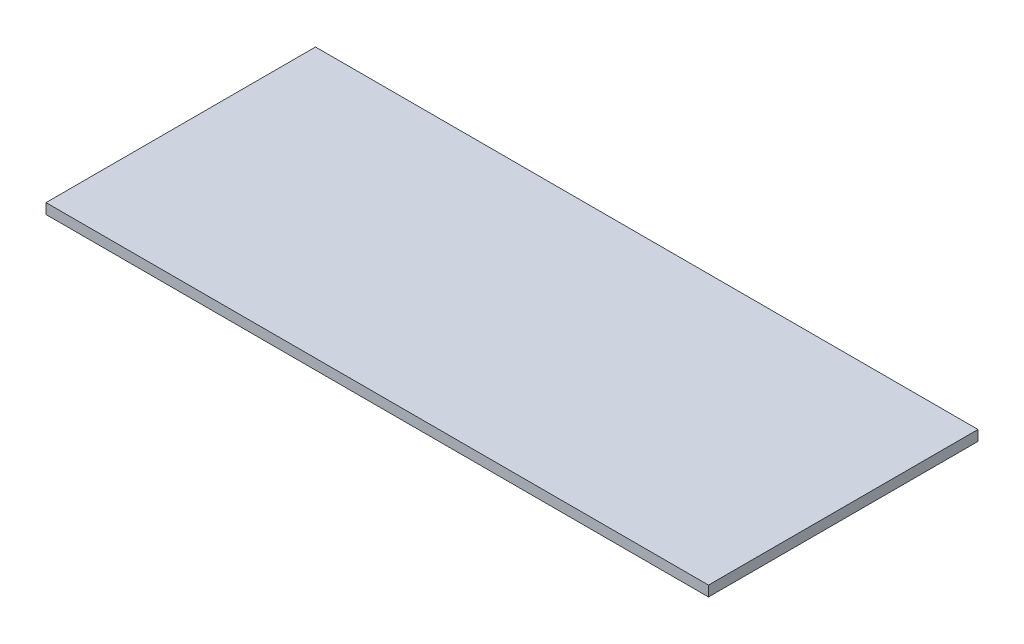
ISO-10303-21;
HEADER;
FILE_DESCRIPTION(('STEP AP214'),'2;1');
FILE_NAME('part.step','',(''),(''),'','','');
FILE_SCHEMA(('AUTOMOTIVE_DESIGN { 1 0 10303 214 1 1 1 1 }'));
ENDSEC;
DATA;
#1=APPLICATION_CONTEXT('core data for automotive mechanical design processes');
#2=APPLICATION_PROTOCOL_DEFINITION('international standard','automotive_design',2000,#1);
#3=PRODUCT_CONTEXT('',#1,'mechanical');
#4=PRODUCT('Part','Part','',(#3));
#5=PRODUCT_RELATED_PRODUCT_CATEGORY('part','',(#4));
#6=PRODUCT_DEFINITION_FORMATION('','',#4);
#7=PRODUCT_DEFINITION_CONTEXT('part definition',#1,'design');
#8=PRODUCT_DEFINITION('design','',#6,#7);
#9=PRODUCT_DEFINITION_SHAPE('','',#8);
#10=(LENGTH_UNIT() NAMED_UNIT(*) SI_UNIT(.MILLI.,.METRE.));
#11=(NAMED_UNIT(*) PLANE_ANGLE_UNIT() SI_UNIT($,.RADIAN.));
#12=(NAMED_UNIT(*) SI_UNIT($,.STERADIAN.) SOLID_ANGLE_UNIT());
#13=UNCERTAINTY_MEASURE_WITH_UNIT(LENGTH_MEASURE(1.E-05),#10,'distance_accuracy_value','');
#14=(GEOMETRIC_REPRESENTATION_CONTEXT(3) GLOBAL_UNCERTAINTY_ASSIGNED_CONTEXT((#13)) GLOBAL_UNIT_ASSIGNED_CONTEXT((#10,
#11,#12)) REPRESENTATION_CONTEXT('',''));
#15=CARTESIAN_POINT('',(0.,0.,0.));
#16=DIRECTION('',(0.,0.,1.));
#17=DIRECTION('',(1.,0.,0.));
#18=AXIS2_PLACEMENT_3D('',#15,#16,#17);
#19=CARTESIAN_POINT('',(-59.1289481870498,4.7625,-95.5994815794485));
#20=DIRECTION('',(1.,0.,0.));
#21=DIRECTION('',(0.,0.,-1.));
#22=AXIS2_PLACEMENT_3D('',#19,#20,#21);
#23=PLANE('',#22);
#24=DIRECTION('',(0.,0.,1.));
#25=VECTOR('',#24,1.);
#26=CARTESIAN_POINT('',(-59.1289481870498,0.,-95.5994815794485));
#27=LINE('',#26,#25);
#28=CARTESIAN_POINT('',(-59.1289481870498,0.,-95.5994815794485));
#29=VERTEX_POINT('',#28);
#30=CARTESIAN_POINT('',(-59.1289481870498,0.,28.4005184205515));
#31=VERTEX_POINT('',#30);
#32=EDGE_CURVE('E99',#29,#31,#27,.T.);
#33=ORIENTED_EDGE('',*,*,#32,.T.);
#34=DIRECTION('',(0.,-1.,0.));
#35=VECTOR('',#34,1.);
#36=CARTESIAN_POINT('',(-59.1289481870498,4.7625,28.4005184205515));
#37=LINE('',#36,#35);
#38=CARTESIAN_POINT('',(-59.1289481870498,4.7625,28.4005184205515));
#39=VERTEX_POINT('',#38);
#40=EDGE_CURVE('E11',#39,#31,#37,.T.);
#41=ORIENTED_EDGE('',*,*,#40,.F.);
#42=DIRECTION('',(0.,0.,1.));
#43=VECTOR('',#42,1.);
#44=CARTESIAN_POINT('',(-59.1289481870498,4.7625,-95.5994815794485));
#45=LINE('',#44,#43);
#46=CARTESIAN_POINT('',(-59.1289481870498,4.7625,-95.5994815794485));
#47=VERTEX_POINT('',#46);
#48=EDGE_CURVE('E87',#47,#39,#45,.T.);
#49=ORIENTED_EDGE('',*,*,#48,.F.);
#50=DIRECTION('',(0.,-1.,0.));
#51=VECTOR('',#50,1.);
#52=CARTESIAN_POINT('',(-59.1289481870498,4.7625,-95.5994815794485));
#53=LINE('',#52,#51);
#54=EDGE_CURVE('E95',#47,#29,#53,.T.);
#55=ORIENTED_EDGE('',*,*,#54,.T.);
#56=EDGE_LOOP('',(#33,#41,#49,#55));
#57=FACE_BOUND('',#56,.T.);
#58=ADVANCED_FACE('F36',(#57),#23,.F.);
#59=CARTESIAN_POINT('',(-59.1289481870498,4.7625,28.4005184205515));
#60=DIRECTION('',(0.,0.,-1.));
#61=DIRECTION('',(-1.,0.,0.));
#62=AXIS2_PLACEMENT_3D('',#59,#60,#61);
#63=PLANE('',#62);
#64=DIRECTION('',(1.,0.,0.));
#65=VECTOR('',#64,1.);
#66=CARTESIAN_POINT('',(-59.1289481870498,0.,28.4005184205515));
#67=LINE('',#66,#65);
#68=CARTESIAN_POINT('',(245.67105181295,0.,28.4005184205515));
#69=VERTEX_POINT('',#68);
#70=EDGE_CURVE('E91',#31,#69,#67,.T.);
#71=ORIENTED_EDGE('',*,*,#70,.T.);
#72=DIRECTION('',(0.,-1.,0.));
#73=VECTOR('',#72,1.);
#74=CARTESIAN_POINT('',(245.67105181295,4.7625,28.4005184205515));
#75=LINE('',#74,#73);
#76=CARTESIAN_POINT('',(245.67105181295,4.7625,28.4005184205515));
#77=VERTEX_POINT('',#76);
#78=EDGE_CURVE('E44',#77,#69,#75,.T.);
#79=ORIENTED_EDGE('',*,*,#78,.F.);
#80=DIRECTION('',(1.,0.,0.));
#81=VECTOR('',#80,1.);
#82=CARTESIAN_POINT('',(-59.1289481870498,4.7625,28.4005184205515));
#83=LINE('',#82,#81);
#84=EDGE_CURVE('E82',#39,#77,#83,.T.);
#85=ORIENTED_EDGE('',*,*,#84,.F.);
#86=ORIENTED_EDGE('',*,*,#40,.T.);
#87=EDGE_LOOP('',(#71,#79,#85,#86));
#88=FACE_BOUND('',#87,.T.);
#89=ADVANCED_FACE('F90',(#88),#63,.F.);
#90=CARTESIAN_POINT('',(245.67105181295,4.7625,-95.5994815794485));
#91=DIRECTION('',(-1.,0.,0.));
#92=DIRECTION('',(0.,0.,1.));
#93=AXIS2_PLACEMENT_3D('',#90,#91,#92);
#94=PLANE('',#93);
#95=DIRECTION('',(0.,0.,-1.));
#96=VECTOR('',#95,1.);
#97=CARTESIAN_POINT('',(245.67105181295,0.,-95.5994815794485));
#98=LINE('',#97,#96);
#99=CARTESIAN_POINT('',(245.67105181295,0.,-95.5994815794485));
#100=VERTEX_POINT('',#99);
#101=EDGE_CURVE('E69',#69,#100,#98,.T.);
#102=ORIENTED_EDGE('',*,*,#101,.T.);
#103=DIRECTION('',(0.,-1.,0.));
#104=VECTOR('',#103,1.);
#105=CARTESIAN_POINT('',(245.67105181295,4.7625,-95.5994815794485));
#106=LINE('',#105,#104);
#107=CARTESIAN_POINT('',(245.67105181295,4.7625,-95.5994815794485));
#108=VERTEX_POINT('',#107);
#109=EDGE_CURVE('E92',#108,#100,#106,.T.);
#110=ORIENTED_EDGE('',*,*,#109,.F.);
#111=DIRECTION('',(0.,0.,-1.));
#112=VECTOR('',#111,1.);
#113=CARTESIAN_POINT('',(245.67105181295,4.7625,-95.5994815794485));
#114=LINE('',#113,#112);
#115=EDGE_CURVE('E85',#77,#108,#114,.T.);
#116=ORIENTED_EDGE('',*,*,#115,.F.);
#117=ORIENTED_EDGE('',*,*,#78,.T.);
#118=EDGE_LOOP('',(#102,#110,#116,#117));
#119=FACE_BOUND('',#118,.T.);
#120=ADVANCED_FACE('F93',(#119),#94,.F.);
#121=CARTESIAN_POINT('',(-59.1289481870498,4.7625,-95.5994815794485));
#122=DIRECTION('',(0.,0.,1.));
#123=DIRECTION('',(1.,0.,0.));
#124=AXIS2_PLACEMENT_3D('',#121,#122,#123);
#125=PLANE('',#124);
#126=DIRECTION('',(-1.,0.,0.));
#127=VECTOR('',#126,1.);
#128=CARTESIAN_POINT('',(-59.1289481870498,0.,-95.5994815794485));
#129=LINE('',#128,#127);
#130=EDGE_CURVE('E75',#100,#29,#129,.T.);
#131=ORIENTED_EDGE('',*,*,#130,.T.);
#132=ORIENTED_EDGE('',*,*,#54,.F.);
#133=DIRECTION('',(-1.,0.,0.));
#134=VECTOR('',#133,1.);
#135=CARTESIAN_POINT('',(-59.1289481870498,4.7625,-95.5994815794485));
#136=LINE('',#135,#134);
#137=EDGE_CURVE('E52',#108,#47,#136,.T.);
#138=ORIENTED_EDGE('',*,*,#137,.F.);
#139=ORIENTED_EDGE('',*,*,#109,.T.);
#140=EDGE_LOOP('',(#131,#132,#138,#139));
#141=FACE_BOUND('',#140,.T.);
#142=ADVANCED_FACE('F106',(#141),#125,.F.);
#143=CARTESIAN_POINT('',(0.,4.7625,0.));
#144=DIRECTION('',(0.,1.,0.));
#145=DIRECTION('',(0.,0.,1.));
#146=AXIS2_PLACEMENT_3D('',#143,#144,#145);
#147=PLANE('',#146);
#148=ORIENTED_EDGE('',*,*,#48,.T.);
#149=ORIENTED_EDGE('',*,*,#84,.T.);
#150=ORIENTED_EDGE('',*,*,#115,.T.);
#151=ORIENTED_EDGE('',*,*,#137,.T.);
#152=EDGE_LOOP('',(#148,#149,#150,#151));
#153=FACE_BOUND('',#152,.T.);
#154=ADVANCED_FACE('F83',(#153),#147,.T.);
#155=CARTESIAN_POINT('',(0.,0.,0.));
#156=DIRECTION('',(0.,1.,0.));
#157=DIRECTION('',(0.,0.,1.));
#158=AXIS2_PLACEMENT_3D('',#155,#156,#157);
#159=PLANE('',#158);
#160=ORIENTED_EDGE('',*,*,#32,.F.);
#161=ORIENTED_EDGE('',*,*,#130,.F.);
#162=ORIENTED_EDGE('',*,*,#101,.F.);
#163=ORIENTED_EDGE('',*,*,#70,.F.);
#164=EDGE_LOOP('',(#160,#161,#162,#163));
#165=FACE_BOUND('',#164,.T.);
#166=ADVANCED_FACE('F109',(#165),#159,.F.);
#167=CLOSED_SHELL('',(#58,#89,#120,#142,#154,#166));
#168=MANIFOLD_SOLID_BREP('B2',#167);
#169=ADVANCED_BREP_SHAPE_REPRESENTATION('',(#18,#168),#14);
#170=SHAPE_DEFINITION_REPRESENTATION(#9,#169);
ENDSEC;
END-ISO-10303-21;
